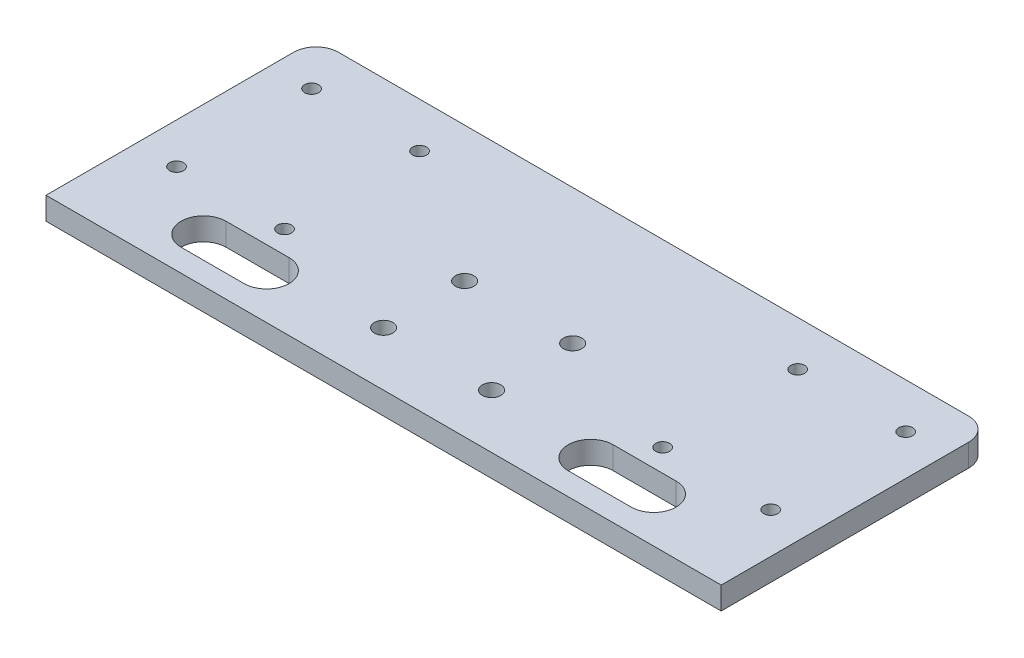
ISO-10303-21;
HEADER;
FILE_DESCRIPTION(('STEP AP214'),'2;1');
FILE_NAME('part.step','',(''),(''),'','','');
FILE_SCHEMA(('AUTOMOTIVE_DESIGN { 1 0 10303 214 1 1 1 1 }'));
ENDSEC;
DATA;
#1=APPLICATION_CONTEXT('core data for automotive mechanical design processes');
#2=APPLICATION_PROTOCOL_DEFINITION('international standard','automotive_design',2000,#1);
#3=PRODUCT_CONTEXT('',#1,'mechanical');
#4=PRODUCT('Part','Part','',(#3));
#5=PRODUCT_RELATED_PRODUCT_CATEGORY('part','',(#4));
#6=PRODUCT_DEFINITION_FORMATION('','',#4);
#7=PRODUCT_DEFINITION_CONTEXT('part definition',#1,'design');
#8=PRODUCT_DEFINITION('design','',#6,#7);
#9=PRODUCT_DEFINITION_SHAPE('','',#8);
#10=(LENGTH_UNIT() NAMED_UNIT(*) SI_UNIT(.MILLI.,.METRE.));
#11=(NAMED_UNIT(*) PLANE_ANGLE_UNIT() SI_UNIT($,.RADIAN.));
#12=(NAMED_UNIT(*) SI_UNIT($,.STERADIAN.) SOLID_ANGLE_UNIT());
#13=UNCERTAINTY_MEASURE_WITH_UNIT(LENGTH_MEASURE(1.E-05),#10,'distance_accuracy_value','');
#14=(GEOMETRIC_REPRESENTATION_CONTEXT(3) GLOBAL_UNCERTAINTY_ASSIGNED_CONTEXT((#13)) GLOBAL_UNIT_ASSIGNED_CONTEXT((#10,
#11,#12)) REPRESENTATION_CONTEXT('',''));
#15=CARTESIAN_POINT('',(0.,0.,0.));
#16=DIRECTION('',(0.,0.,1.));
#17=DIRECTION('',(1.,0.,0.));
#18=AXIS2_PLACEMENT_3D('',#15,#16,#17);
#19=CARTESIAN_POINT('',(75.,5.,-30.));
#20=DIRECTION('',(-1.,0.,0.));
#21=DIRECTION('',(0.,0.,1.));
#22=AXIS2_PLACEMENT_3D('',#19,#20,#21);
#23=PLANE('',#22);
#24=DIRECTION('',(0.,0.,-1.));
#25=VECTOR('',#24,1.);
#26=CARTESIAN_POINT('',(75.,0.,-30.));
#27=LINE('',#26,#25);
#28=CARTESIAN_POINT('',(75.,0.,30.));
#29=VERTEX_POINT('',#28);
#30=CARTESIAN_POINT('',(75.,0.,-25.));
#31=VERTEX_POINT('',#30);
#32=EDGE_CURVE('E303',#29,#31,#27,.T.);
#33=ORIENTED_EDGE('',*,*,#32,.T.);
#34=DIRECTION('',(0.,-1.,0.));
#35=VECTOR('',#34,1.);
#36=CARTESIAN_POINT('',(75.,5.,-25.));
#37=LINE('',#36,#35);
#38=CARTESIAN_POINT('',(75.,5.,-25.));
#39=VERTEX_POINT('',#38);
#40=EDGE_CURVE('E362',#31,#39,#37,.F.);
#41=ORIENTED_EDGE('',*,*,#40,.T.);
#42=DIRECTION('',(0.,0.,-1.));
#43=VECTOR('',#42,1.);
#44=CARTESIAN_POINT('',(75.,5.,-30.));
#45=LINE('',#44,#43);
#46=CARTESIAN_POINT('',(75.,5.,30.));
#47=VERTEX_POINT('',#46);
#48=EDGE_CURVE('E304',#47,#39,#45,.T.);
#49=ORIENTED_EDGE('',*,*,#48,.F.);
#50=DIRECTION('',(0.,-1.,0.));
#51=VECTOR('',#50,1.);
#52=CARTESIAN_POINT('',(75.,5.,30.));
#53=LINE('',#52,#51);
#54=EDGE_CURVE('E319',#47,#29,#53,.T.);
#55=ORIENTED_EDGE('',*,*,#54,.T.);
#56=EDGE_LOOP('',(#33,#41,#49,#55));
#57=FACE_BOUND('',#56,.T.);
#58=ADVANCED_FACE('F39',(#57),#23,.F.);
#59=CARTESIAN_POINT('',(-75.,5.,-30.));
#60=DIRECTION('',(0.,0.,1.));
#61=DIRECTION('',(1.,0.,0.));
#62=AXIS2_PLACEMENT_3D('',#59,#60,#61);
#63=PLANE('',#62);
#64=DIRECTION('',(-1.,0.,0.));
#65=VECTOR('',#64,1.);
#66=CARTESIAN_POINT('',(-75.,0.,-30.));
#67=LINE('',#66,#65);
#68=CARTESIAN_POINT('',(70.,0.,-30.));
#69=VERTEX_POINT('',#68);
#70=CARTESIAN_POINT('',(-70.,0.,-30.));
#71=VERTEX_POINT('',#70);
#72=EDGE_CURVE('E323',#69,#71,#67,.T.);
#73=ORIENTED_EDGE('',*,*,#72,.T.);
#74=DIRECTION('',(0.,-1.,0.));
#75=VECTOR('',#74,1.);
#76=CARTESIAN_POINT('',(-70.,5.,-30.));
#77=LINE('',#76,#75);
#78=CARTESIAN_POINT('',(-70.,5.,-30.));
#79=VERTEX_POINT('',#78);
#80=EDGE_CURVE('E353',#71,#79,#77,.F.);
#81=ORIENTED_EDGE('',*,*,#80,.T.);
#82=DIRECTION('',(-1.,0.,0.));
#83=VECTOR('',#82,1.);
#84=CARTESIAN_POINT('',(-75.,5.,-30.));
#85=LINE('',#84,#83);
#86=CARTESIAN_POINT('',(70.,5.,-30.));
#87=VERTEX_POINT('',#86);
#88=EDGE_CURVE('E308',#87,#79,#85,.T.);
#89=ORIENTED_EDGE('',*,*,#88,.F.);
#90=DIRECTION('',(0.,-1.,0.));
#91=VECTOR('',#90,1.);
#92=CARTESIAN_POINT('',(70.,5.,-30.));
#93=LINE('',#92,#91);
#94=EDGE_CURVE('E349',#87,#69,#93,.T.);
#95=ORIENTED_EDGE('',*,*,#94,.T.);
#96=EDGE_LOOP('',(#73,#81,#89,#95));
#97=FACE_BOUND('',#96,.T.);
#98=ADVANCED_FACE('F408',(#97),#63,.F.);
#99=CARTESIAN_POINT('',(-75.,5.,-30.));
#100=DIRECTION('',(1.,0.,0.));
#101=DIRECTION('',(0.,0.,-1.));
#102=AXIS2_PLACEMENT_3D('',#99,#100,#101);
#103=PLANE('',#102);
#104=DIRECTION('',(0.,0.,1.));
#105=VECTOR('',#104,1.);
#106=CARTESIAN_POINT('',(-75.,5.,-30.));
#107=LINE('',#106,#105);
#108=CARTESIAN_POINT('',(-75.,5.,-25.));
#109=VERTEX_POINT('',#108);
#110=CARTESIAN_POINT('',(-75.,5.,30.));
#111=VERTEX_POINT('',#110);
#112=EDGE_CURVE('E313',#109,#111,#107,.T.);
#113=ORIENTED_EDGE('',*,*,#112,.F.);
#114=DIRECTION('',(0.,-1.,0.));
#115=VECTOR('',#114,1.);
#116=CARTESIAN_POINT('',(-75.,5.,-25.));
#117=LINE('',#116,#115);
#118=CARTESIAN_POINT('',(-75.,0.,-25.));
#119=VERTEX_POINT('',#118);
#120=EDGE_CURVE('E339',#109,#119,#117,.T.);
#121=ORIENTED_EDGE('',*,*,#120,.T.);
#122=DIRECTION('',(0.,0.,1.));
#123=VECTOR('',#122,1.);
#124=CARTESIAN_POINT('',(-75.,0.,-30.));
#125=LINE('',#124,#123);
#126=CARTESIAN_POINT('',(-75.,0.,30.));
#127=VERTEX_POINT('',#126);
#128=EDGE_CURVE('E327',#119,#127,#125,.T.);
#129=ORIENTED_EDGE('',*,*,#128,.T.);
#130=DIRECTION('',(0.,-1.,0.));
#131=VECTOR('',#130,1.);
#132=CARTESIAN_POINT('',(-75.,5.,30.));
#133=LINE('',#132,#131);
#134=EDGE_CURVE('E335',#111,#127,#133,.T.);
#135=ORIENTED_EDGE('',*,*,#134,.F.);
#136=EDGE_LOOP('',(#113,#121,#129,#135));
#137=FACE_BOUND('',#136,.T.);
#138=ADVANCED_FACE('F414',(#137),#103,.F.);
#139=CARTESIAN_POINT('',(-75.,5.,30.));
#140=DIRECTION('',(0.,0.,-1.));
#141=DIRECTION('',(-1.,0.,0.));
#142=AXIS2_PLACEMENT_3D('',#139,#140,#141);
#143=PLANE('',#142);
#144=DIRECTION('',(1.,0.,0.));
#145=VECTOR('',#144,1.);
#146=CARTESIAN_POINT('',(-75.,0.,30.));
#147=LINE('',#146,#145);
#148=EDGE_CURVE('E309',#127,#29,#147,.T.);
#149=ORIENTED_EDGE('',*,*,#148,.T.);
#150=ORIENTED_EDGE('',*,*,#54,.F.);
#151=DIRECTION('',(1.,0.,0.));
#152=VECTOR('',#151,1.);
#153=CARTESIAN_POINT('',(-75.,5.,30.));
#154=LINE('',#153,#152);
#155=EDGE_CURVE('E316',#111,#47,#154,.T.);
#156=ORIENTED_EDGE('',*,*,#155,.F.);
#157=ORIENTED_EDGE('',*,*,#134,.T.);
#158=EDGE_LOOP('',(#149,#150,#156,#157));
#159=FACE_BOUND('',#158,.T.);
#160=ADVANCED_FACE('F444',(#159),#143,.F.);
#161=CARTESIAN_POINT('',(0.,5.,0.));
#162=DIRECTION('',(0.,1.,0.));
#163=DIRECTION('',(0.,0.,1.));
#164=AXIS2_PLACEMENT_3D('',#161,#162,#163);
#165=PLANE('',#164);
#166=CARTESIAN_POINT('',(-50.,5.,20.));
#167=DIRECTION('',(0.,1.,0.));
#168=DIRECTION('',(0.,0.,1.));
#169=AXIS2_PLACEMENT_3D('',#166,#167,#168);
#170=CIRCLE('',#169,4.99999999999998);
#171=CARTESIAN_POINT('',(-50.,5.,15.));
#172=VERTEX_POINT('',#171);
#173=CARTESIAN_POINT('',(-50.,5.,25.));
#174=VERTEX_POINT('',#173);
#175=EDGE_CURVE('E55',#172,#174,#170,.T.);
#176=ORIENTED_EDGE('',*,*,#175,.F.);
#177=DIRECTION('',(-1.,0.,0.));
#178=VECTOR('',#177,1.);
#179=CARTESIAN_POINT('',(-50.,5.,15.));
#180=LINE('',#179,#178);
#181=CARTESIAN_POINT('',(-36.,5.,15.));
#182=VERTEX_POINT('',#181);
#183=EDGE_CURVE('E167',#182,#172,#180,.T.);
#184=ORIENTED_EDGE('',*,*,#183,.F.);
#185=CARTESIAN_POINT('',(-36.,5.,20.));
#186=DIRECTION('',(0.,1.,0.));
#187=DIRECTION('',(0.,0.,1.));
#188=AXIS2_PLACEMENT_3D('',#185,#186,#187);
#189=CIRCLE('',#188,4.99999999999999);
#190=CARTESIAN_POINT('',(-36.,5.,25.));
#191=VERTEX_POINT('',#190);
#192=EDGE_CURVE('E148',#191,#182,#189,.T.);
#193=ORIENTED_EDGE('',*,*,#192,.F.);
#194=DIRECTION('',(1.,0.,0.));
#195=VECTOR('',#194,1.);
#196=CARTESIAN_POINT('',(-50.,5.,25.));
#197=LINE('',#196,#195);
#198=EDGE_CURVE('E159',#174,#191,#197,.T.);
#199=ORIENTED_EDGE('',*,*,#198,.F.);
#200=EDGE_LOOP('',(#176,#184,#193,#199));
#201=FACE_BOUND('',#200,.T.);
#202=CARTESIAN_POINT('',(50.,5.,20.));
#203=DIRECTION('',(0.,1.,0.));
#204=DIRECTION('',(0.,0.,-1.));
#205=AXIS2_PLACEMENT_3D('',#202,#203,#204);
#206=CIRCLE('',#205,4.99999999999998);
#207=CARTESIAN_POINT('',(50.,5.,25.));
#208=VERTEX_POINT('',#207);
#209=CARTESIAN_POINT('',(50.,5.,15.));
#210=VERTEX_POINT('',#209);
#211=EDGE_CURVE('E63',#208,#210,#206,.T.);
#212=ORIENTED_EDGE('',*,*,#211,.F.);
#213=DIRECTION('',(1.,0.,0.));
#214=VECTOR('',#213,1.);
#215=CARTESIAN_POINT('',(50.,5.,25.));
#216=LINE('',#215,#214);
#217=CARTESIAN_POINT('',(36.,5.,25.));
#218=VERTEX_POINT('',#217);
#219=EDGE_CURVE('E192',#218,#208,#216,.T.);
#220=ORIENTED_EDGE('',*,*,#219,.F.);
#221=CARTESIAN_POINT('',(36.,5.,20.));
#222=DIRECTION('',(0.,1.,0.));
#223=DIRECTION('',(0.,0.,-1.));
#224=AXIS2_PLACEMENT_3D('',#221,#222,#223);
#225=CIRCLE('',#224,4.99999999999999);
#226=CARTESIAN_POINT('',(36.,5.,15.));
#227=VERTEX_POINT('',#226);
#228=EDGE_CURVE('E188',#227,#218,#225,.T.);
#229=ORIENTED_EDGE('',*,*,#228,.F.);
#230=DIRECTION('',(-1.,0.,0.));
#231=VECTOR('',#230,1.);
#232=CARTESIAN_POINT('',(50.,5.,15.));
#233=LINE('',#232,#231);
#234=EDGE_CURVE('E184',#210,#227,#233,.T.);
#235=ORIENTED_EDGE('',*,*,#234,.F.);
#236=EDGE_LOOP('',(#212,#220,#229,#235));
#237=FACE_BOUND('',#236,.T.);
#238=CARTESIAN_POINT('',(12.,5.,0.));
#239=DIRECTION('',(0.,1.,0.));
#240=DIRECTION('',(0.,0.,1.));
#241=AXIS2_PLACEMENT_3D('',#238,#239,#240);
#242=CIRCLE('',#241,2.05);
#243=CARTESIAN_POINT('',(12.,5.,2.05000000000007));
#244=VERTEX_POINT('',#243);
#245=EDGE_CURVE('E221',#244,#244,#242,.T.);
#246=ORIENTED_EDGE('',*,*,#245,.F.);
#247=EDGE_LOOP('',(#246));
#248=FACE_BOUND('',#247,.T.);
#249=CARTESIAN_POINT('',(-12.,5.,18.0000000000001));
#250=DIRECTION('',(0.,1.,0.));
#251=DIRECTION('',(0.,0.,1.));
#252=AXIS2_PLACEMENT_3D('',#249,#250,#251);
#253=CIRCLE('',#252,2.05);
#254=CARTESIAN_POINT('',(-12.,5.,20.0500000000001));
#255=VERTEX_POINT('',#254);
#256=EDGE_CURVE('E212',#255,#255,#253,.T.);
#257=ORIENTED_EDGE('',*,*,#256,.F.);
#258=EDGE_LOOP('',(#257));
#259=FACE_BOUND('',#258,.T.);
#260=CARTESIAN_POINT('',(12.,5.,18.0000000000001));
#261=DIRECTION('',(0.,1.,0.));
#262=DIRECTION('',(0.,0.,1.));
#263=AXIS2_PLACEMENT_3D('',#260,#261,#262);
#264=CIRCLE('',#263,2.05);
#265=CARTESIAN_POINT('',(12.,5.,20.0500000000001));
#266=VERTEX_POINT('',#265);
#267=EDGE_CURVE('E177',#266,#266,#264,.T.);
#268=ORIENTED_EDGE('',*,*,#267,.F.);
#269=EDGE_LOOP('',(#268));
#270=FACE_BOUND('',#269,.T.);
#271=CARTESIAN_POINT('',(-12.,5.,0.));
#272=DIRECTION('',(0.,1.,0.));
#273=DIRECTION('',(0.,0.,1.));
#274=AXIS2_PLACEMENT_3D('',#271,#272,#273);
#275=CIRCLE('',#274,2.05);
#276=CARTESIAN_POINT('',(-12.,5.,2.05000000000007));
#277=VERTEX_POINT('',#276);
#278=EDGE_CURVE('E220',#277,#277,#275,.T.);
#279=ORIENTED_EDGE('',*,*,#278,.F.);
#280=EDGE_LOOP('',(#279));
#281=FACE_BOUND('',#280,.T.);
#282=CARTESIAN_POINT('',(-41.9999999999999,5.,-20.));
#283=DIRECTION('',(0.,1.,0.));
#284=DIRECTION('',(0.,0.,1.));
#285=AXIS2_PLACEMENT_3D('',#282,#283,#284);
#286=CIRCLE('',#285,1.55);
#287=CARTESIAN_POINT('',(-41.9999999999999,5.,-18.45));
#288=VERTEX_POINT('',#287);
#289=EDGE_CURVE('E299',#288,#288,#286,.T.);
#290=ORIENTED_EDGE('',*,*,#289,.F.);
#291=EDGE_LOOP('',(#290));
#292=FACE_BOUND('',#291,.T.);
#293=CARTESIAN_POINT('',(42.0000000000001,5.,9.99999999999999));
#294=DIRECTION('',(0.,1.,0.));
#295=DIRECTION('',(0.,0.,1.));
#296=AXIS2_PLACEMENT_3D('',#293,#294,#295);
#297=CIRCLE('',#296,1.55);
#298=CARTESIAN_POINT('',(42.0000000000001,5.,11.55));
#299=VERTEX_POINT('',#298);
#300=EDGE_CURVE('E295',#299,#299,#297,.T.);
#301=ORIENTED_EDGE('',*,*,#300,.F.);
#302=EDGE_LOOP('',(#301));
#303=FACE_BOUND('',#302,.T.);
#304=CARTESIAN_POINT('',(66.0000000000001,5.,9.99999999999999));
#305=DIRECTION('',(0.,1.,0.));
#306=DIRECTION('',(0.,0.,1.));
#307=AXIS2_PLACEMENT_3D('',#304,#305,#306);
#308=CIRCLE('',#307,1.55000000000001);
#309=CARTESIAN_POINT('',(66.0000000000001,5.,11.55));
#310=VERTEX_POINT('',#309);
#311=EDGE_CURVE('E291',#310,#310,#308,.T.);
#312=ORIENTED_EDGE('',*,*,#311,.F.);
#313=EDGE_LOOP('',(#312));
#314=FACE_BOUND('',#313,.T.);
#315=CARTESIAN_POINT('',(42.0000000000001,5.,-20.));
#316=DIRECTION('',(0.,1.,0.));
#317=DIRECTION('',(0.,0.,1.));
#318=AXIS2_PLACEMENT_3D('',#315,#316,#317);
#319=CIRCLE('',#318,1.55);
#320=CARTESIAN_POINT('',(42.0000000000001,5.,-18.45));
#321=VERTEX_POINT('',#320);
#322=EDGE_CURVE('E287',#321,#321,#319,.T.);
#323=ORIENTED_EDGE('',*,*,#322,.F.);
#324=EDGE_LOOP('',(#323));
#325=FACE_BOUND('',#324,.T.);
#326=CARTESIAN_POINT('',(-65.9999999999999,5.,9.99999999999998));
#327=DIRECTION('',(0.,1.,0.));
#328=DIRECTION('',(0.,0.,1.));
#329=AXIS2_PLACEMENT_3D('',#326,#327,#328);
#330=CIRCLE('',#329,1.55000000000001);
#331=CARTESIAN_POINT('',(-65.9999999999999,5.,11.55));
#332=VERTEX_POINT('',#331);
#333=EDGE_CURVE('E283',#332,#332,#330,.T.);
#334=ORIENTED_EDGE('',*,*,#333,.F.);
#335=EDGE_LOOP('',(#334));
#336=FACE_BOUND('',#335,.T.);
#337=CARTESIAN_POINT('',(-41.9999999999999,5.,9.99999999999998));
#338=DIRECTION('',(0.,1.,0.));
#339=DIRECTION('',(0.,0.,1.));
#340=AXIS2_PLACEMENT_3D('',#337,#338,#339);
#341=CIRCLE('',#340,1.55);
#342=CARTESIAN_POINT('',(-41.9999999999999,5.,11.55));
#343=VERTEX_POINT('',#342);
#344=EDGE_CURVE('E279',#343,#343,#341,.T.);
#345=ORIENTED_EDGE('',*,*,#344,.F.);
#346=EDGE_LOOP('',(#345));
#347=FACE_BOUND('',#346,.T.);
#348=CARTESIAN_POINT('',(-65.9999999999999,5.,-20.));
#349=DIRECTION('',(0.,1.,0.));
#350=DIRECTION('',(0.,0.,1.));
#351=AXIS2_PLACEMENT_3D('',#348,#349,#350);
#352=CIRCLE('',#351,1.54999999999999);
#353=CARTESIAN_POINT('',(-65.9999999999999,5.,-18.45));
#354=VERTEX_POINT('',#353);
#355=EDGE_CURVE('E275',#354,#354,#352,.T.);
#356=ORIENTED_EDGE('',*,*,#355,.F.);
#357=EDGE_LOOP('',(#356));
#358=FACE_BOUND('',#357,.T.);
#359=CARTESIAN_POINT('',(66.0000000000001,5.,-20.));
#360=DIRECTION('',(0.,1.,0.));
#361=DIRECTION('',(0.,0.,1.));
#362=AXIS2_PLACEMENT_3D('',#359,#360,#361);
#363=CIRCLE('',#362,1.55000000000001);
#364=CARTESIAN_POINT('',(66.0000000000001,5.,-18.45));
#365=VERTEX_POINT('',#364);
#366=EDGE_CURVE('E271',#365,#365,#363,.T.);
#367=ORIENTED_EDGE('',*,*,#366,.F.);
#368=EDGE_LOOP('',(#367));
#369=FACE_BOUND('',#368,.T.);
#370=ORIENTED_EDGE('',*,*,#88,.T.);
#371=CARTESIAN_POINT('',(-70.,5.,-25.));
#372=DIRECTION('',(0.,1.,0.));
#373=DIRECTION('',(0.,0.,1.));
#374=AXIS2_PLACEMENT_3D('',#371,#372,#373);
#375=CIRCLE('',#374,5.);
#376=EDGE_CURVE('E359',#79,#109,#375,.T.);
#377=ORIENTED_EDGE('',*,*,#376,.T.);
#378=ORIENTED_EDGE('',*,*,#112,.T.);
#379=ORIENTED_EDGE('',*,*,#155,.T.);
#380=ORIENTED_EDGE('',*,*,#48,.T.);
#381=CARTESIAN_POINT('',(70.,5.,-25.));
#382=DIRECTION('',(0.,1.,0.));
#383=DIRECTION('',(0.,0.,1.));
#384=AXIS2_PLACEMENT_3D('',#381,#382,#383);
#385=CIRCLE('',#384,5.);
#386=EDGE_CURVE('E356',#39,#87,#385,.T.);
#387=ORIENTED_EDGE('',*,*,#386,.T.);
#388=EDGE_LOOP('',(#370,#377,#378,#379,#380,#387));
#389=FACE_BOUND('',#388,.T.);
#390=ADVANCED_FACE('F164',(#201,#237,#248,#259,#270,#281,#292,#303,#314,#325,#336,#347,#358,
#369,#389),#165,.T.);
#391=CARTESIAN_POINT('',(0.,0.,0.));
#392=DIRECTION('',(0.,1.,0.));
#393=DIRECTION('',(0.,0.,1.));
#394=AXIS2_PLACEMENT_3D('',#391,#392,#393);
#395=PLANE('',#394);
#396=DIRECTION('',(-1.,0.,0.));
#397=VECTOR('',#396,1.);
#398=CARTESIAN_POINT('',(0.,0.,15.));
#399=LINE('',#398,#397);
#400=CARTESIAN_POINT('',(-36.,0.,15.));
#401=VERTEX_POINT('',#400);
#402=CARTESIAN_POINT('',(-50.,0.,15.));
#403=VERTEX_POINT('',#402);
#404=EDGE_CURVE('E48',#401,#403,#399,.T.);
#405=ORIENTED_EDGE('',*,*,#404,.T.);
#406=CARTESIAN_POINT('',(-50.,0.,20.));
#407=DIRECTION('',(0.,1.,0.));
#408=DIRECTION('',(0.,0.,1.));
#409=AXIS2_PLACEMENT_3D('',#406,#407,#408);
#410=CIRCLE('',#409,4.99999999999998);
#411=CARTESIAN_POINT('',(-50.,0.,25.));
#412=VERTEX_POINT('',#411);
#413=EDGE_CURVE('E11',#403,#412,#410,.T.);
#414=ORIENTED_EDGE('',*,*,#413,.T.);
#415=DIRECTION('',(1.,0.,0.));
#416=VECTOR('',#415,1.);
#417=CARTESIAN_POINT('',(0.,0.,25.));
#418=LINE('',#417,#416);
#419=CARTESIAN_POINT('',(-36.,0.,25.));
#420=VERTEX_POINT('',#419);
#421=EDGE_CURVE('E381',#412,#420,#418,.T.);
#422=ORIENTED_EDGE('',*,*,#421,.T.);
#423=CARTESIAN_POINT('',(-36.,0.,20.));
#424=DIRECTION('',(0.,1.,0.));
#425=DIRECTION('',(0.,0.,1.));
#426=AXIS2_PLACEMENT_3D('',#423,#424,#425);
#427=CIRCLE('',#426,4.99999999999999);
#428=EDGE_CURVE('E151',#420,#401,#427,.T.);
#429=ORIENTED_EDGE('',*,*,#428,.T.);
#430=EDGE_LOOP('',(#405,#414,#422,#429));
#431=FACE_BOUND('',#430,.T.);
#432=DIRECTION('',(1.,0.,0.));
#433=VECTOR('',#432,1.);
#434=CARTESIAN_POINT('',(0.,0.,25.));
#435=LINE('',#434,#433);
#436=CARTESIAN_POINT('',(36.,0.,25.));
#437=VERTEX_POINT('',#436);
#438=CARTESIAN_POINT('',(50.,0.,25.));
#439=VERTEX_POINT('',#438);
#440=EDGE_CURVE('E373',#437,#439,#435,.T.);
#441=ORIENTED_EDGE('',*,*,#440,.T.);
#442=CARTESIAN_POINT('',(50.,0.,20.));
#443=DIRECTION('',(0.,1.,0.));
#444=DIRECTION('',(0.,0.,1.));
#445=AXIS2_PLACEMENT_3D('',#442,#443,#444);
#446=CIRCLE('',#445,4.99999999999998);
#447=CARTESIAN_POINT('',(50.,0.,15.));
#448=VERTEX_POINT('',#447);
#449=EDGE_CURVE('E377',#439,#448,#446,.T.);
#450=ORIENTED_EDGE('',*,*,#449,.T.);
#451=DIRECTION('',(-1.,0.,0.));
#452=VECTOR('',#451,1.);
#453=CARTESIAN_POINT('',(0.,0.,15.));
#454=LINE('',#453,#452);
#455=CARTESIAN_POINT('',(36.,0.,15.));
#456=VERTEX_POINT('',#455);
#457=EDGE_CURVE('E365',#448,#456,#454,.T.);
#458=ORIENTED_EDGE('',*,*,#457,.T.);
#459=CARTESIAN_POINT('',(36.,0.,20.));
#460=DIRECTION('',(0.,1.,0.));
#461=DIRECTION('',(0.,0.,1.));
#462=AXIS2_PLACEMENT_3D('',#459,#460,#461);
#463=CIRCLE('',#462,4.99999999999999);
#464=EDGE_CURVE('E369',#456,#437,#463,.T.);
#465=ORIENTED_EDGE('',*,*,#464,.T.);
#466=EDGE_LOOP('',(#441,#450,#458,#465));
#467=FACE_BOUND('',#466,.T.);
#468=CARTESIAN_POINT('',(12.,0.,0.));
#469=DIRECTION('',(0.,1.,0.));
#470=DIRECTION('',(0.,0.,1.));
#471=AXIS2_PLACEMENT_3D('',#468,#469,#470);
#472=CIRCLE('',#471,2.05);
#473=CARTESIAN_POINT('',(12.,0.,2.05000000000007));
#474=VERTEX_POINT('',#473);
#475=EDGE_CURVE('E216',#474,#474,#472,.T.);
#476=ORIENTED_EDGE('',*,*,#475,.T.);
#477=EDGE_LOOP('',(#476));
#478=FACE_BOUND('',#477,.T.);
#479=CARTESIAN_POINT('',(-12.,0.,18.0000000000001));
#480=DIRECTION('',(0.,1.,0.));
#481=DIRECTION('',(0.,0.,1.));
#482=AXIS2_PLACEMENT_3D('',#479,#480,#481);
#483=CIRCLE('',#482,2.05);
#484=CARTESIAN_POINT('',(-12.,0.,20.0500000000001));
#485=VERTEX_POINT('',#484);
#486=EDGE_CURVE('E225',#485,#485,#483,.T.);
#487=ORIENTED_EDGE('',*,*,#486,.T.);
#488=EDGE_LOOP('',(#487));
#489=FACE_BOUND('',#488,.T.);
#490=CARTESIAN_POINT('',(12.,0.,18.0000000000001));
#491=DIRECTION('',(0.,1.,0.));
#492=DIRECTION('',(0.,0.,1.));
#493=AXIS2_PLACEMENT_3D('',#490,#491,#492);
#494=CIRCLE('',#493,2.05);
#495=CARTESIAN_POINT('',(12.,0.,20.0500000000001));
#496=VERTEX_POINT('',#495);
#497=EDGE_CURVE('E208',#496,#496,#494,.T.);
#498=ORIENTED_EDGE('',*,*,#497,.T.);
#499=EDGE_LOOP('',(#498));
#500=FACE_BOUND('',#499,.T.);
#501=CARTESIAN_POINT('',(-12.,0.,0.));
#502=DIRECTION('',(0.,1.,0.));
#503=DIRECTION('',(0.,0.,1.));
#504=AXIS2_PLACEMENT_3D('',#501,#502,#503);
#505=CIRCLE('',#504,2.05);
#506=CARTESIAN_POINT('',(-12.,0.,2.05000000000007));
#507=VERTEX_POINT('',#506);
#508=EDGE_CURVE('E232',#507,#507,#505,.T.);
#509=ORIENTED_EDGE('',*,*,#508,.T.);
#510=EDGE_LOOP('',(#509));
#511=FACE_BOUND('',#510,.T.);
#512=CARTESIAN_POINT('',(-41.9999999999999,0.,-20.));
#513=DIRECTION('',(0.,-1.,0.));
#514=DIRECTION('',(0.,0.,-1.));
#515=AXIS2_PLACEMENT_3D('',#512,#513,#514);
#516=CIRCLE('',#515,1.55);
#517=CARTESIAN_POINT('',(-41.9999999999999,0.,-21.55));
#518=VERTEX_POINT('',#517);
#519=EDGE_CURVE('E248',#518,#518,#516,.T.);
#520=ORIENTED_EDGE('',*,*,#519,.F.);
#521=EDGE_LOOP('',(#520));
#522=FACE_BOUND('',#521,.T.);
#523=CARTESIAN_POINT('',(42.0000000000001,0.,9.99999999999999));
#524=DIRECTION('',(0.,-1.,0.));
#525=DIRECTION('',(0.,0.,-1.));
#526=AXIS2_PLACEMENT_3D('',#523,#524,#525);
#527=CIRCLE('',#526,1.55);
#528=CARTESIAN_POINT('',(42.0000000000001,0.,8.44999999999999));
#529=VERTEX_POINT('',#528);
#530=EDGE_CURVE('E252',#529,#529,#527,.T.);
#531=ORIENTED_EDGE('',*,*,#530,.F.);
#532=EDGE_LOOP('',(#531));
#533=FACE_BOUND('',#532,.T.);
#534=CARTESIAN_POINT('',(66.0000000000001,0.,9.99999999999999));
#535=DIRECTION('',(0.,-1.,0.));
#536=DIRECTION('',(0.,0.,-1.));
#537=AXIS2_PLACEMENT_3D('',#534,#535,#536);
#538=CIRCLE('',#537,1.55000000000001);
#539=CARTESIAN_POINT('',(66.0000000000001,0.,8.44999999999999));
#540=VERTEX_POINT('',#539);
#541=EDGE_CURVE('E256',#540,#540,#538,.T.);
#542=ORIENTED_EDGE('',*,*,#541,.F.);
#543=EDGE_LOOP('',(#542));
#544=FACE_BOUND('',#543,.T.);
#545=CARTESIAN_POINT('',(42.0000000000001,0.,-20.));
#546=DIRECTION('',(0.,-1.,0.));
#547=DIRECTION('',(0.,0.,-1.));
#548=AXIS2_PLACEMENT_3D('',#545,#546,#547);
#549=CIRCLE('',#548,1.55);
#550=CARTESIAN_POINT('',(42.0000000000001,0.,-21.55));
#551=VERTEX_POINT('',#550);
#552=EDGE_CURVE('E260',#551,#551,#549,.T.);
#553=ORIENTED_EDGE('',*,*,#552,.F.);
#554=EDGE_LOOP('',(#553));
#555=FACE_BOUND('',#554,.T.);
#556=CARTESIAN_POINT('',(-65.9999999999999,0.,9.99999999999998));
#557=DIRECTION('',(0.,-1.,0.));
#558=DIRECTION('',(0.,0.,-1.));
#559=AXIS2_PLACEMENT_3D('',#556,#557,#558);
#560=CIRCLE('',#559,1.55000000000001);
#561=CARTESIAN_POINT('',(-65.9999999999999,0.,8.44999999999997));
#562=VERTEX_POINT('',#561);
#563=EDGE_CURVE('E236',#562,#562,#560,.T.);
#564=ORIENTED_EDGE('',*,*,#563,.F.);
#565=EDGE_LOOP('',(#564));
#566=FACE_BOUND('',#565,.T.);
#567=CARTESIAN_POINT('',(-41.9999999999999,0.,9.99999999999998));
#568=DIRECTION('',(0.,-1.,0.));
#569=DIRECTION('',(0.,0.,-1.));
#570=AXIS2_PLACEMENT_3D('',#567,#568,#569);
#571=CIRCLE('',#570,1.55);
#572=CARTESIAN_POINT('',(-41.9999999999999,0.,8.44999999999998));
#573=VERTEX_POINT('',#572);
#574=EDGE_CURVE('E243',#573,#573,#571,.T.);
#575=ORIENTED_EDGE('',*,*,#574,.F.);
#576=EDGE_LOOP('',(#575));
#577=FACE_BOUND('',#576,.T.);
#578=CARTESIAN_POINT('',(-65.9999999999999,0.,-20.));
#579=DIRECTION('',(0.,-1.,0.));
#580=DIRECTION('',(0.,0.,-1.));
#581=AXIS2_PLACEMENT_3D('',#578,#579,#580);
#582=CIRCLE('',#581,1.54999999999999);
#583=CARTESIAN_POINT('',(-65.9999999999999,0.,-21.55));
#584=VERTEX_POINT('',#583);
#585=EDGE_CURVE('E244',#584,#584,#582,.T.);
#586=ORIENTED_EDGE('',*,*,#585,.F.);
#587=EDGE_LOOP('',(#586));
#588=FACE_BOUND('',#587,.T.);
#589=CARTESIAN_POINT('',(66.0000000000001,0.,-20.));
#590=DIRECTION('',(0.,-1.,0.));
#591=DIRECTION('',(0.,0.,-1.));
#592=AXIS2_PLACEMENT_3D('',#589,#590,#591);
#593=CIRCLE('',#592,1.55000000000001);
#594=CARTESIAN_POINT('',(66.0000000000001,0.,-21.55));
#595=VERTEX_POINT('',#594);
#596=EDGE_CURVE('E264',#595,#595,#593,.T.);
#597=ORIENTED_EDGE('',*,*,#596,.F.);
#598=EDGE_LOOP('',(#597));
#599=FACE_BOUND('',#598,.T.);
#600=ORIENTED_EDGE('',*,*,#128,.F.);
#601=CARTESIAN_POINT('',(-70.,0.,-25.));
#602=DIRECTION('',(0.,1.,0.));
#603=DIRECTION('',(0.,0.,1.));
#604=AXIS2_PLACEMENT_3D('',#601,#602,#603);
#605=CIRCLE('',#604,5.);
#606=EDGE_CURVE('E346',#119,#71,#605,.F.);
#607=ORIENTED_EDGE('',*,*,#606,.T.);
#608=ORIENTED_EDGE('',*,*,#72,.F.);
#609=CARTESIAN_POINT('',(70.,0.,-25.));
#610=DIRECTION('',(0.,1.,0.));
#611=DIRECTION('',(0.,0.,1.));
#612=AXIS2_PLACEMENT_3D('',#609,#610,#611);
#613=CIRCLE('',#612,5.);
#614=EDGE_CURVE('E343',#69,#31,#613,.F.);
#615=ORIENTED_EDGE('',*,*,#614,.T.);
#616=ORIENTED_EDGE('',*,*,#32,.F.);
#617=ORIENTED_EDGE('',*,*,#148,.F.);
#618=EDGE_LOOP('',(#600,#607,#608,#615,#616,#617));
#619=FACE_BOUND('',#618,.T.);
#620=ADVANCED_FACE('F388',(#431,#467,#478,#489,#500,#511,#522,#533,#544,#555,#566,#577,#588,
#599,#619),#395,.F.);
#621=CARTESIAN_POINT('',(66.0000000000001,10.,-20.));
#622=DIRECTION('',(0.,-1.,0.));
#623=DIRECTION('',(0.,0.,-1.));
#624=AXIS2_PLACEMENT_3D('',#621,#622,#623);
#625=CYLINDRICAL_SURFACE('',#624,1.55000000000001);
#626=ORIENTED_EDGE('',*,*,#366,.T.);
#627=EDGE_LOOP('',(#626));
#628=FACE_BOUND('',#627,.T.);
#629=ORIENTED_EDGE('',*,*,#596,.T.);
#630=EDGE_LOOP('',(#629));
#631=FACE_BOUND('',#630,.T.);
#632=ADVANCED_FACE('F453',(#628,#631),#625,.F.);
#633=CARTESIAN_POINT('',(-65.9999999999999,10.,-20.));
#634=DIRECTION('',(0.,-1.,0.));
#635=DIRECTION('',(0.,0.,-1.));
#636=AXIS2_PLACEMENT_3D('',#633,#634,#635);
#637=CYLINDRICAL_SURFACE('',#636,1.54999999999999);
#638=ORIENTED_EDGE('',*,*,#355,.T.);
#639=EDGE_LOOP('',(#638));
#640=FACE_BOUND('',#639,.T.);
#641=ORIENTED_EDGE('',*,*,#585,.T.);
#642=EDGE_LOOP('',(#641));
#643=FACE_BOUND('',#642,.T.);
#644=ADVANCED_FACE('F459',(#640,#643),#637,.F.);
#645=CARTESIAN_POINT('',(-41.9999999999999,10.,9.99999999999998));
#646=DIRECTION('',(0.,-1.,0.));
#647=DIRECTION('',(0.,0.,-1.));
#648=AXIS2_PLACEMENT_3D('',#645,#646,#647);
#649=CYLINDRICAL_SURFACE('',#648,1.55);
#650=ORIENTED_EDGE('',*,*,#344,.T.);
#651=EDGE_LOOP('',(#650));
#652=FACE_BOUND('',#651,.T.);
#653=ORIENTED_EDGE('',*,*,#574,.T.);
#654=EDGE_LOOP('',(#653));
#655=FACE_BOUND('',#654,.T.);
#656=ADVANCED_FACE('F565',(#652,#655),#649,.F.);
#657=CARTESIAN_POINT('',(-65.9999999999999,10.,9.99999999999998));
#658=DIRECTION('',(0.,-1.,0.));
#659=DIRECTION('',(0.,0.,-1.));
#660=AXIS2_PLACEMENT_3D('',#657,#658,#659);
#661=CYLINDRICAL_SURFACE('',#660,1.55000000000001);
#662=ORIENTED_EDGE('',*,*,#333,.T.);
#663=EDGE_LOOP('',(#662));
#664=FACE_BOUND('',#663,.T.);
#665=ORIENTED_EDGE('',*,*,#563,.T.);
#666=EDGE_LOOP('',(#665));
#667=FACE_BOUND('',#666,.T.);
#668=ADVANCED_FACE('F561',(#664,#667),#661,.F.);
#669=CARTESIAN_POINT('',(42.0000000000001,10.,-20.));
#670=DIRECTION('',(0.,-1.,0.));
#671=DIRECTION('',(0.,0.,-1.));
#672=AXIS2_PLACEMENT_3D('',#669,#670,#671);
#673=CYLINDRICAL_SURFACE('',#672,1.55);
#674=ORIENTED_EDGE('',*,*,#322,.T.);
#675=EDGE_LOOP('',(#674));
#676=FACE_BOUND('',#675,.T.);
#677=ORIENTED_EDGE('',*,*,#552,.T.);
#678=EDGE_LOOP('',(#677));
#679=FACE_BOUND('',#678,.T.);
#680=ADVANCED_FACE('F564',(#676,#679),#673,.F.);
#681=CARTESIAN_POINT('',(66.0000000000001,10.,9.99999999999999));
#682=DIRECTION('',(0.,-1.,0.));
#683=DIRECTION('',(0.,0.,-1.));
#684=AXIS2_PLACEMENT_3D('',#681,#682,#683);
#685=CYLINDRICAL_SURFACE('',#684,1.55000000000001);
#686=ORIENTED_EDGE('',*,*,#311,.T.);
#687=EDGE_LOOP('',(#686));
#688=FACE_BOUND('',#687,.T.);
#689=ORIENTED_EDGE('',*,*,#541,.T.);
#690=EDGE_LOOP('',(#689));
#691=FACE_BOUND('',#690,.T.);
#692=ADVANCED_FACE('F576',(#688,#691),#685,.F.);
#693=CARTESIAN_POINT('',(42.0000000000001,10.,9.99999999999999));
#694=DIRECTION('',(0.,-1.,0.));
#695=DIRECTION('',(0.,0.,-1.));
#696=AXIS2_PLACEMENT_3D('',#693,#694,#695);
#697=CYLINDRICAL_SURFACE('',#696,1.55);
#698=ORIENTED_EDGE('',*,*,#300,.T.);
#699=EDGE_LOOP('',(#698));
#700=FACE_BOUND('',#699,.T.);
#701=ORIENTED_EDGE('',*,*,#530,.T.);
#702=EDGE_LOOP('',(#701));
#703=FACE_BOUND('',#702,.T.);
#704=ADVANCED_FACE('F573',(#700,#703),#697,.F.);
#705=CARTESIAN_POINT('',(-41.9999999999999,10.,-20.));
#706=DIRECTION('',(0.,-1.,0.));
#707=DIRECTION('',(0.,0.,-1.));
#708=AXIS2_PLACEMENT_3D('',#705,#706,#707);
#709=CYLINDRICAL_SURFACE('',#708,1.55);
#710=ORIENTED_EDGE('',*,*,#289,.T.);
#711=EDGE_LOOP('',(#710));
#712=FACE_BOUND('',#711,.T.);
#713=ORIENTED_EDGE('',*,*,#519,.T.);
#714=EDGE_LOOP('',(#713));
#715=FACE_BOUND('',#714,.T.);
#716=ADVANCED_FACE('F559',(#712,#715),#709,.F.);
#717=CARTESIAN_POINT('',(-12.,0.,0.));
#718=DIRECTION('',(0.,1.,0.));
#719=DIRECTION('',(0.,0.,1.));
#720=AXIS2_PLACEMENT_3D('',#717,#718,#719);
#721=CYLINDRICAL_SURFACE('',#720,2.05);
#722=ORIENTED_EDGE('',*,*,#508,.F.);
#723=EDGE_LOOP('',(#722));
#724=FACE_BOUND('',#723,.T.);
#725=ORIENTED_EDGE('',*,*,#278,.T.);
#726=EDGE_LOOP('',(#725));
#727=FACE_BOUND('',#726,.T.);
#728=ADVANCED_FACE('F551',(#724,#727),#721,.F.);
#729=CARTESIAN_POINT('',(12.,0.,18.0000000000001));
#730=DIRECTION('',(0.,1.,0.));
#731=DIRECTION('',(0.,0.,1.));
#732=AXIS2_PLACEMENT_3D('',#729,#730,#731);
#733=CYLINDRICAL_SURFACE('',#732,2.05);
#734=ORIENTED_EDGE('',*,*,#497,.F.);
#735=EDGE_LOOP('',(#734));
#736=FACE_BOUND('',#735,.T.);
#737=ORIENTED_EDGE('',*,*,#267,.T.);
#738=EDGE_LOOP('',(#737));
#739=FACE_BOUND('',#738,.T.);
#740=ADVANCED_FACE('F549',(#736,#739),#733,.F.);
#741=CARTESIAN_POINT('',(-12.,0.,18.0000000000001));
#742=DIRECTION('',(0.,1.,0.));
#743=DIRECTION('',(0.,0.,1.));
#744=AXIS2_PLACEMENT_3D('',#741,#742,#743);
#745=CYLINDRICAL_SURFACE('',#744,2.05);
#746=ORIENTED_EDGE('',*,*,#486,.F.);
#747=EDGE_LOOP('',(#746));
#748=FACE_BOUND('',#747,.T.);
#749=ORIENTED_EDGE('',*,*,#256,.T.);
#750=EDGE_LOOP('',(#749));
#751=FACE_BOUND('',#750,.T.);
#752=ADVANCED_FACE('F428',(#748,#751),#745,.F.);
#753=CARTESIAN_POINT('',(12.,0.,0.));
#754=DIRECTION('',(0.,1.,0.));
#755=DIRECTION('',(0.,0.,1.));
#756=AXIS2_PLACEMENT_3D('',#753,#754,#755);
#757=CYLINDRICAL_SURFACE('',#756,2.05);
#758=ORIENTED_EDGE('',*,*,#475,.F.);
#759=EDGE_LOOP('',(#758));
#760=FACE_BOUND('',#759,.T.);
#761=ORIENTED_EDGE('',*,*,#245,.T.);
#762=EDGE_LOOP('',(#761));
#763=FACE_BOUND('',#762,.T.);
#764=ADVANCED_FACE('F420',(#760,#763),#757,.F.);
#765=CARTESIAN_POINT('',(-70.,5.,-25.));
#766=DIRECTION('',(0.,-1.,0.));
#767=DIRECTION('',(0.,0.,-1.));
#768=AXIS2_PLACEMENT_3D('',#765,#766,#767);
#769=CYLINDRICAL_SURFACE('',#768,5.);
#770=ORIENTED_EDGE('',*,*,#376,.F.);
#771=ORIENTED_EDGE('',*,*,#80,.F.);
#772=ORIENTED_EDGE('',*,*,#606,.F.);
#773=ORIENTED_EDGE('',*,*,#120,.F.);
#774=EDGE_LOOP('',(#770,#771,#772,#773));
#775=FACE_BOUND('',#774,.T.);
#776=ADVANCED_FACE('F418',(#775),#769,.T.);
#777=CARTESIAN_POINT('',(70.,5.,-25.));
#778=DIRECTION('',(0.,-1.,0.));
#779=DIRECTION('',(0.,0.,-1.));
#780=AXIS2_PLACEMENT_3D('',#777,#778,#779);
#781=CYLINDRICAL_SURFACE('',#780,5.);
#782=ORIENTED_EDGE('',*,*,#386,.F.);
#783=ORIENTED_EDGE('',*,*,#40,.F.);
#784=ORIENTED_EDGE('',*,*,#614,.F.);
#785=ORIENTED_EDGE('',*,*,#94,.F.);
#786=EDGE_LOOP('',(#782,#783,#784,#785));
#787=FACE_BOUND('',#786,.T.);
#788=ADVANCED_FACE('F41',(#787),#781,.T.);
#789=CARTESIAN_POINT('',(50.,-5.,20.));
#790=DIRECTION('',(0.,1.,0.));
#791=DIRECTION('',(0.,0.,1.));
#792=AXIS2_PLACEMENT_3D('',#789,#790,#791);
#793=CYLINDRICAL_SURFACE('',#792,4.99999999999998);
#794=DIRECTION('',(0.,1.,0.));
#795=VECTOR('',#794,1.);
#796=CARTESIAN_POINT('',(50.,-5.,25.));
#797=LINE('',#796,#795);
#798=EDGE_CURVE('E197',#439,#208,#797,.T.);
#799=ORIENTED_EDGE('',*,*,#798,.T.);
#800=ORIENTED_EDGE('',*,*,#211,.T.);
#801=DIRECTION('',(0.,1.,0.));
#802=VECTOR('',#801,1.);
#803=CARTESIAN_POINT('',(50.,-5.,15.));
#804=LINE('',#803,#802);
#805=EDGE_CURVE('E196',#448,#210,#804,.T.);
#806=ORIENTED_EDGE('',*,*,#805,.F.);
#807=ORIENTED_EDGE('',*,*,#449,.F.);
#808=EDGE_LOOP('',(#799,#800,#806,#807));
#809=FACE_BOUND('',#808,.T.);
#810=ADVANCED_FACE('F426',(#809),#793,.F.);
#811=CARTESIAN_POINT('',(50.,-5.,25.));
#812=DIRECTION('',(0.,0.,1.));
#813=DIRECTION('',(1.,0.,0.));
#814=AXIS2_PLACEMENT_3D('',#811,#812,#813);
#815=PLANE('',#814);
#816=DIRECTION('',(0.,1.,0.));
#817=VECTOR('',#816,1.);
#818=CARTESIAN_POINT('',(36.,-5.,25.));
#819=LINE('',#818,#817);
#820=EDGE_CURVE('E200',#437,#218,#819,.T.);
#821=ORIENTED_EDGE('',*,*,#820,.T.);
#822=ORIENTED_EDGE('',*,*,#219,.T.);
#823=ORIENTED_EDGE('',*,*,#798,.F.);
#824=ORIENTED_EDGE('',*,*,#440,.F.);
#825=EDGE_LOOP('',(#821,#822,#823,#824));
#826=FACE_BOUND('',#825,.T.);
#827=ADVANCED_FACE('F496',(#826),#815,.F.);
#828=CARTESIAN_POINT('',(36.,-5.,20.));
#829=DIRECTION('',(0.,1.,0.));
#830=DIRECTION('',(0.,0.,1.));
#831=AXIS2_PLACEMENT_3D('',#828,#829,#830);
#832=CYLINDRICAL_SURFACE('',#831,4.99999999999999);
#833=DIRECTION('',(0.,1.,0.));
#834=VECTOR('',#833,1.);
#835=CARTESIAN_POINT('',(36.,-5.,15.));
#836=LINE('',#835,#834);
#837=EDGE_CURVE('E203',#456,#227,#836,.T.);
#838=ORIENTED_EDGE('',*,*,#837,.T.);
#839=ORIENTED_EDGE('',*,*,#228,.T.);
#840=ORIENTED_EDGE('',*,*,#820,.F.);
#841=ORIENTED_EDGE('',*,*,#464,.F.);
#842=EDGE_LOOP('',(#838,#839,#840,#841));
#843=FACE_BOUND('',#842,.T.);
#844=ADVANCED_FACE('F402',(#843),#832,.F.);
#845=CARTESIAN_POINT('',(50.,-5.,15.));
#846=DIRECTION('',(0.,0.,-1.));
#847=DIRECTION('',(-1.,0.,0.));
#848=AXIS2_PLACEMENT_3D('',#845,#846,#847);
#849=PLANE('',#848);
#850=ORIENTED_EDGE('',*,*,#805,.T.);
#851=ORIENTED_EDGE('',*,*,#234,.T.);
#852=ORIENTED_EDGE('',*,*,#837,.F.);
#853=ORIENTED_EDGE('',*,*,#457,.F.);
#854=EDGE_LOOP('',(#850,#851,#852,#853));
#855=FACE_BOUND('',#854,.T.);
#856=ADVANCED_FACE('F395',(#855),#849,.F.);
#857=CARTESIAN_POINT('',(-50.,-5.,20.));
#858=DIRECTION('',(0.,1.,0.));
#859=DIRECTION('',(0.,0.,1.));
#860=AXIS2_PLACEMENT_3D('',#857,#858,#859);
#861=CYLINDRICAL_SURFACE('',#860,4.99999999999998);
#862=DIRECTION('',(0.,1.,0.));
#863=VECTOR('',#862,1.);
#864=CARTESIAN_POINT('',(-50.,-5.,15.));
#865=LINE('',#864,#863);
#866=EDGE_CURVE('E174',#403,#172,#865,.T.);
#867=ORIENTED_EDGE('',*,*,#866,.T.);
#868=ORIENTED_EDGE('',*,*,#175,.T.);
#869=DIRECTION('',(0.,1.,0.));
#870=VECTOR('',#869,1.);
#871=CARTESIAN_POINT('',(-50.,-5.,25.));
#872=LINE('',#871,#870);
#873=EDGE_CURVE('E156',#412,#174,#872,.T.);
#874=ORIENTED_EDGE('',*,*,#873,.F.);
#875=ORIENTED_EDGE('',*,*,#413,.F.);
#876=EDGE_LOOP('',(#867,#868,#874,#875));
#877=FACE_BOUND('',#876,.T.);
#878=ADVANCED_FACE('F393',(#877),#861,.F.);
#879=CARTESIAN_POINT('',(-50.,-5.,15.));
#880=DIRECTION('',(0.,0.,-1.));
#881=DIRECTION('',(-1.,0.,0.));
#882=AXIS2_PLACEMENT_3D('',#879,#880,#881);
#883=PLANE('',#882);
#884=DIRECTION('',(0.,1.,0.));
#885=VECTOR('',#884,1.);
#886=CARTESIAN_POINT('',(-36.,-5.,15.));
#887=LINE('',#886,#885);
#888=EDGE_CURVE('E155',#401,#182,#887,.T.);
#889=ORIENTED_EDGE('',*,*,#888,.T.);
#890=ORIENTED_EDGE('',*,*,#183,.T.);
#891=ORIENTED_EDGE('',*,*,#866,.F.);
#892=ORIENTED_EDGE('',*,*,#404,.F.);
#893=EDGE_LOOP('',(#889,#890,#891,#892));
#894=FACE_BOUND('',#893,.T.);
#895=ADVANCED_FACE('F392',(#894),#883,.F.);
#896=CARTESIAN_POINT('',(-36.,-5.,20.));
#897=DIRECTION('',(0.,1.,0.));
#898=DIRECTION('',(0.,0.,1.));
#899=AXIS2_PLACEMENT_3D('',#896,#897,#898);
#900=CYLINDRICAL_SURFACE('',#899,4.99999999999999);
#901=DIRECTION('',(0.,1.,0.));
#902=VECTOR('',#901,1.);
#903=CARTESIAN_POINT('',(-36.,-5.,25.));
#904=LINE('',#903,#902);
#905=EDGE_CURVE('E143',#420,#191,#904,.T.);
#906=ORIENTED_EDGE('',*,*,#905,.T.);
#907=ORIENTED_EDGE('',*,*,#192,.T.);
#908=ORIENTED_EDGE('',*,*,#888,.F.);
#909=ORIENTED_EDGE('',*,*,#428,.F.);
#910=EDGE_LOOP('',(#906,#907,#908,#909));
#911=FACE_BOUND('',#910,.T.);
#912=ADVANCED_FACE('F145',(#911),#900,.F.);
#913=CARTESIAN_POINT('',(-50.,-5.,25.));
#914=DIRECTION('',(0.,0.,1.));
#915=DIRECTION('',(1.,0.,0.));
#916=AXIS2_PLACEMENT_3D('',#913,#914,#915);
#917=PLANE('',#916);
#918=ORIENTED_EDGE('',*,*,#873,.T.);
#919=ORIENTED_EDGE('',*,*,#198,.T.);
#920=ORIENTED_EDGE('',*,*,#905,.F.);
#921=ORIENTED_EDGE('',*,*,#421,.F.);
#922=EDGE_LOOP('',(#918,#919,#920,#921));
#923=FACE_BOUND('',#922,.T.);
#924=ADVANCED_FACE('F160',(#923),#917,.F.);
#925=CLOSED_SHELL('',(#58,#98,#138,#160,#390,#620,#632,#644,#656,#668,#680,#692,#704,#716,#728,
#740,#752,#764,#776,#788,#810,#827,#844,#856,#878,#895,#912,#924));
#926=MANIFOLD_SOLID_BREP('B2',#925);
#927=ADVANCED_BREP_SHAPE_REPRESENTATION('',(#18,#926),#14);
#928=SHAPE_DEFINITION_REPRESENTATION(#9,#927);
ENDSEC;
END-ISO-10303-21;
